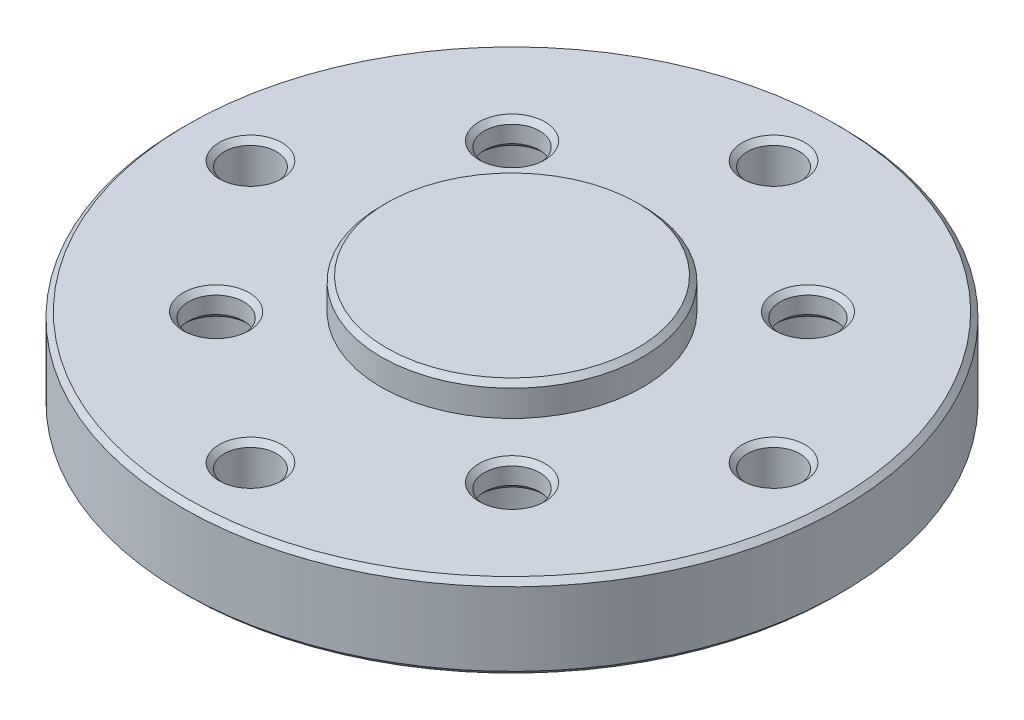
ISO-10303-21;
HEADER;
FILE_DESCRIPTION(('STEP AP214'),'2;1');
FILE_NAME('part.step','',(''),(''),'','','');
FILE_SCHEMA(('AUTOMOTIVE_DESIGN { 1 0 10303 214 1 1 1 1 }'));
ENDSEC;
DATA;
#1=APPLICATION_CONTEXT('core data for automotive mechanical design processes');
#2=APPLICATION_PROTOCOL_DEFINITION('international standard','automotive_design',2000,#1);
#3=PRODUCT_CONTEXT('',#1,'mechanical');
#4=PRODUCT('Part','Part','',(#3));
#5=PRODUCT_RELATED_PRODUCT_CATEGORY('part','',(#4));
#6=PRODUCT_DEFINITION_FORMATION('','',#4);
#7=PRODUCT_DEFINITION_CONTEXT('part definition',#1,'design');
#8=PRODUCT_DEFINITION('design','',#6,#7);
#9=PRODUCT_DEFINITION_SHAPE('','',#8);
#10=(LENGTH_UNIT() NAMED_UNIT(*) SI_UNIT(.MILLI.,.METRE.));
#11=(NAMED_UNIT(*) PLANE_ANGLE_UNIT() SI_UNIT($,.RADIAN.));
#12=(NAMED_UNIT(*) SI_UNIT($,.STERADIAN.) SOLID_ANGLE_UNIT());
#13=UNCERTAINTY_MEASURE_WITH_UNIT(LENGTH_MEASURE(1.E-05),#10,'distance_accuracy_value','');
#14=(GEOMETRIC_REPRESENTATION_CONTEXT(3) GLOBAL_UNCERTAINTY_ASSIGNED_CONTEXT((#13)) GLOBAL_UNIT_ASSIGNED_CONTEXT((#10,
#11,#12)) REPRESENTATION_CONTEXT('',''));
#15=CARTESIAN_POINT('',(0.,0.,0.));
#16=DIRECTION('',(0.,0.,1.));
#17=DIRECTION('',(1.,0.,0.));
#18=AXIS2_PLACEMENT_3D('',#15,#16,#17);
#19=CARTESIAN_POINT('',(0.,8.,0.));
#20=DIRECTION('',(0.,-1.,0.));
#21=DIRECTION('',(0.,0.,-1.));
#22=AXIS2_PLACEMENT_3D('',#19,#20,#21);
#23=CYLINDRICAL_SURFACE('',#22,31.5);
#24=CARTESIAN_POINT('',(0.,0.5,0.));
#25=DIRECTION('',(0.,1.,0.));
#26=DIRECTION('',(0.,0.,1.));
#27=AXIS2_PLACEMENT_3D('',#24,#25,#26);
#28=CIRCLE('',#27,31.5);
#29=CARTESIAN_POINT('',(0.,0.5,31.5));
#30=VERTEX_POINT('',#29);
#31=EDGE_CURVE('E43',#30,#30,#28,.T.);
#32=ORIENTED_EDGE('',*,*,#31,.T.);
#33=EDGE_LOOP('',(#32));
#34=FACE_BOUND('',#33,.T.);
#35=CARTESIAN_POINT('',(0.,7.50000000000003,0.));
#36=DIRECTION('',(0.,1.,0.));
#37=DIRECTION('',(0.,0.,1.));
#38=AXIS2_PLACEMENT_3D('',#35,#36,#37);
#39=CIRCLE('',#38,31.5);
#40=CARTESIAN_POINT('',(0.,7.50000000000003,31.5));
#41=VERTEX_POINT('',#40);
#42=EDGE_CURVE('E47',#41,#41,#39,.F.);
#43=ORIENTED_EDGE('',*,*,#42,.T.);
#44=EDGE_LOOP('',(#43));
#45=FACE_BOUND('',#44,.T.);
#46=ADVANCED_FACE('F32',(#34,#45),#23,.T.);
#47=CARTESIAN_POINT('',(0.,8.,0.));
#48=DIRECTION('',(0.,1.,0.));
#49=DIRECTION('',(0.,0.,1.));
#50=AXIS2_PLACEMENT_3D('',#47,#48,#49);
#51=PLANE('',#50);
#52=CARTESIAN_POINT('',(14.1421356237309,8.,14.142135623731));
#53=DIRECTION('',(0.,1.,0.));
#54=DIRECTION('',(0.,0.,1.));
#55=AXIS2_PLACEMENT_3D('',#52,#53,#54);
#56=CIRCLE('',#55,3.15000000000003);
#57=CARTESIAN_POINT('',(14.1421356237309,8.,17.292135623731));
#58=VERTEX_POINT('',#57);
#59=EDGE_CURVE('E145',#58,#58,#56,.F.);
#60=ORIENTED_EDGE('',*,*,#59,.T.);
#61=EDGE_LOOP('',(#60));
#62=FACE_BOUND('',#61,.T.);
#63=CARTESIAN_POINT('',(-14.1421356237309,8.,-14.1421356237309));
#64=DIRECTION('',(0.,1.,0.));
#65=DIRECTION('',(0.,0.,1.));
#66=AXIS2_PLACEMENT_3D('',#63,#64,#65);
#67=CIRCLE('',#66,3.15000000000003);
#68=CARTESIAN_POINT('',(-14.1421356237309,8.,-10.9921356237309));
#69=VERTEX_POINT('',#68);
#70=EDGE_CURVE('E148',#69,#69,#67,.F.);
#71=ORIENTED_EDGE('',*,*,#70,.T.);
#72=EDGE_LOOP('',(#71));
#73=FACE_BOUND('',#72,.T.);
#74=CARTESIAN_POINT('',(-14.1421356237309,8.,14.1421356237309));
#75=DIRECTION('',(0.,1.,0.));
#76=DIRECTION('',(0.,0.,1.));
#77=AXIS2_PLACEMENT_3D('',#74,#75,#76);
#78=CIRCLE('',#77,3.15000000000003);
#79=CARTESIAN_POINT('',(-14.1421356237309,8.,17.292135623731));
#80=VERTEX_POINT('',#79);
#81=EDGE_CURVE('E151',#80,#80,#78,.F.);
#82=ORIENTED_EDGE('',*,*,#81,.T.);
#83=EDGE_LOOP('',(#82));
#84=FACE_BOUND('',#83,.T.);
#85=CARTESIAN_POINT('',(14.1421356237309,8.,-14.1421356237309));
#86=DIRECTION('',(0.,1.,0.));
#87=DIRECTION('',(0.,0.,1.));
#88=AXIS2_PLACEMENT_3D('',#85,#86,#87);
#89=CIRCLE('',#88,3.15000000000003);
#90=CARTESIAN_POINT('',(14.1421356237309,8.,-10.9921356237309));
#91=VERTEX_POINT('',#90);
#92=EDGE_CURVE('E154',#91,#91,#89,.F.);
#93=ORIENTED_EDGE('',*,*,#92,.T.);
#94=EDGE_LOOP('',(#93));
#95=FACE_BOUND('',#94,.T.);
#96=CARTESIAN_POINT('',(0.,8.,25.));
#97=DIRECTION('',(0.,1.,0.));
#98=DIRECTION('',(0.,0.,1.));
#99=AXIS2_PLACEMENT_3D('',#96,#97,#98);
#100=CIRCLE('',#99,3.00000000000003);
#101=CARTESIAN_POINT('',(0.,8.,28.));
#102=VERTEX_POINT('',#101);
#103=EDGE_CURVE('E157',#102,#102,#100,.F.);
#104=ORIENTED_EDGE('',*,*,#103,.T.);
#105=EDGE_LOOP('',(#104));
#106=FACE_BOUND('',#105,.T.);
#107=CARTESIAN_POINT('',(25.,8.,0.));
#108=DIRECTION('',(0.,1.,0.));
#109=DIRECTION('',(0.,0.,1.));
#110=AXIS2_PLACEMENT_3D('',#107,#108,#109);
#111=CIRCLE('',#110,3.00000000000003);
#112=CARTESIAN_POINT('',(25.,8.,3.00000000000003));
#113=VERTEX_POINT('',#112);
#114=EDGE_CURVE('E160',#113,#113,#111,.F.);
#115=ORIENTED_EDGE('',*,*,#114,.T.);
#116=EDGE_LOOP('',(#115));
#117=FACE_BOUND('',#116,.T.);
#118=CARTESIAN_POINT('',(0.,8.,-25.));
#119=DIRECTION('',(0.,1.,0.));
#120=DIRECTION('',(0.,0.,1.));
#121=AXIS2_PLACEMENT_3D('',#118,#119,#120);
#122=CIRCLE('',#121,3.00000000000003);
#123=CARTESIAN_POINT('',(0.,8.,-22.));
#124=VERTEX_POINT('',#123);
#125=EDGE_CURVE('E163',#124,#124,#122,.F.);
#126=ORIENTED_EDGE('',*,*,#125,.T.);
#127=EDGE_LOOP('',(#126));
#128=FACE_BOUND('',#127,.T.);
#129=CARTESIAN_POINT('',(-25.,8.,0.));
#130=DIRECTION('',(0.,1.,0.));
#131=DIRECTION('',(0.,0.,1.));
#132=AXIS2_PLACEMENT_3D('',#129,#130,#131);
#133=CIRCLE('',#132,3.00000000000002);
#134=CARTESIAN_POINT('',(-25.,8.,3.00000000000002));
#135=VERTEX_POINT('',#134);
#136=EDGE_CURVE('E166',#135,#135,#133,.F.);
#137=ORIENTED_EDGE('',*,*,#136,.T.);
#138=EDGE_LOOP('',(#137));
#139=FACE_BOUND('',#138,.T.);
#140=CARTESIAN_POINT('',(0.,8.,0.));
#141=DIRECTION('',(0.,1.,0.));
#142=DIRECTION('',(0.,0.,1.));
#143=AXIS2_PLACEMENT_3D('',#140,#141,#142);
#144=CIRCLE('',#143,31.);
#145=CARTESIAN_POINT('',(0.,8.,31.));
#146=VERTEX_POINT('',#145);
#147=EDGE_CURVE('E169',#146,#146,#144,.T.);
#148=ORIENTED_EDGE('',*,*,#147,.T.);
#149=EDGE_LOOP('',(#148));
#150=FACE_BOUND('',#149,.T.);
#151=CARTESIAN_POINT('',(0.,8.,0.));
#152=DIRECTION('',(0.,1.,0.));
#153=DIRECTION('',(0.,0.,1.));
#154=AXIS2_PLACEMENT_3D('',#151,#152,#153);
#155=CIRCLE('',#154,12.5);
#156=CARTESIAN_POINT('',(0.,8.,12.5));
#157=VERTEX_POINT('',#156);
#158=EDGE_CURVE('E178',#157,#157,#155,.T.);
#159=ORIENTED_EDGE('',*,*,#158,.F.);
#160=EDGE_LOOP('',(#159));
#161=FACE_BOUND('',#160,.T.);
#162=ADVANCED_FACE('F212',(#62,#73,#84,#95,#106,#117,#128,#139,#150,#161),#51,.T.);
#163=CARTESIAN_POINT('',(0.,0.,0.));
#164=DIRECTION('',(0.,1.,0.));
#165=DIRECTION('',(0.,0.,1.));
#166=AXIS2_PLACEMENT_3D('',#163,#164,#165);
#167=PLANE('',#166);
#168=CARTESIAN_POINT('',(25.,0.,0.));
#169=DIRECTION('',(0.,1.,0.));
#170=DIRECTION('',(0.,0.,1.));
#171=AXIS2_PLACEMENT_3D('',#168,#169,#170);
#172=CIRCLE('',#171,3.);
#173=CARTESIAN_POINT('',(25.,0.,3.));
#174=VERTEX_POINT('',#173);
#175=EDGE_CURVE('E88',#174,#174,#172,.T.);
#176=ORIENTED_EDGE('',*,*,#175,.T.);
#177=EDGE_LOOP('',(#176));
#178=FACE_BOUND('',#177,.T.);
#179=CARTESIAN_POINT('',(0.,0.,25.));
#180=DIRECTION('',(0.,1.,0.));
#181=DIRECTION('',(0.,0.,1.));
#182=AXIS2_PLACEMENT_3D('',#179,#180,#181);
#183=CIRCLE('',#182,3.);
#184=CARTESIAN_POINT('',(0.,0.,28.));
#185=VERTEX_POINT('',#184);
#186=EDGE_CURVE('E91',#185,#185,#183,.T.);
#187=ORIENTED_EDGE('',*,*,#186,.T.);
#188=EDGE_LOOP('',(#187));
#189=FACE_BOUND('',#188,.T.);
#190=CARTESIAN_POINT('',(-25.,0.,0.));
#191=DIRECTION('',(0.,1.,0.));
#192=DIRECTION('',(0.,0.,1.));
#193=AXIS2_PLACEMENT_3D('',#190,#191,#192);
#194=CIRCLE('',#193,3.);
#195=CARTESIAN_POINT('',(-25.,0.,3.00000000000001));
#196=VERTEX_POINT('',#195);
#197=EDGE_CURVE('E94',#196,#196,#194,.T.);
#198=ORIENTED_EDGE('',*,*,#197,.T.);
#199=EDGE_LOOP('',(#198));
#200=FACE_BOUND('',#199,.T.);
#201=CARTESIAN_POINT('',(0.,0.,-25.));
#202=DIRECTION('',(0.,1.,0.));
#203=DIRECTION('',(0.,0.,1.));
#204=AXIS2_PLACEMENT_3D('',#201,#202,#203);
#205=CIRCLE('',#204,3.);
#206=CARTESIAN_POINT('',(0.,0.,-22.));
#207=VERTEX_POINT('',#206);
#208=EDGE_CURVE('E97',#207,#207,#205,.T.);
#209=ORIENTED_EDGE('',*,*,#208,.T.);
#210=EDGE_LOOP('',(#209));
#211=FACE_BOUND('',#210,.T.);
#212=CARTESIAN_POINT('',(-14.1421356237309,0.,-14.1421356237309));
#213=DIRECTION('',(0.,1.,0.));
#214=DIRECTION('',(0.,0.,1.));
#215=AXIS2_PLACEMENT_3D('',#212,#213,#214);
#216=CIRCLE('',#215,5.50000000000002);
#217=CARTESIAN_POINT('',(-14.1421356237309,0.,-8.64213562373093));
#218=VERTEX_POINT('',#217);
#219=EDGE_CURVE('E100',#218,#218,#216,.T.);
#220=ORIENTED_EDGE('',*,*,#219,.T.);
#221=EDGE_LOOP('',(#220));
#222=FACE_BOUND('',#221,.T.);
#223=CARTESIAN_POINT('',(14.1421356237309,0.,-14.1421356237309));
#224=DIRECTION('',(0.,1.,0.));
#225=DIRECTION('',(0.,0.,1.));
#226=AXIS2_PLACEMENT_3D('',#223,#224,#225);
#227=CIRCLE('',#226,5.50000000000002);
#228=CARTESIAN_POINT('',(14.1421356237309,0.,-8.64213562373093));
#229=VERTEX_POINT('',#228);
#230=EDGE_CURVE('E103',#229,#229,#227,.T.);
#231=ORIENTED_EDGE('',*,*,#230,.T.);
#232=EDGE_LOOP('',(#231));
#233=FACE_BOUND('',#232,.T.);
#234=CARTESIAN_POINT('',(14.1421356237309,0.,14.142135623731));
#235=DIRECTION('',(0.,1.,0.));
#236=DIRECTION('',(0.,0.,1.));
#237=AXIS2_PLACEMENT_3D('',#234,#235,#236);
#238=CIRCLE('',#237,5.49999999999998);
#239=CARTESIAN_POINT('',(14.1421356237309,0.,19.6421356237309));
#240=VERTEX_POINT('',#239);
#241=EDGE_CURVE('E106',#240,#240,#238,.T.);
#242=ORIENTED_EDGE('',*,*,#241,.T.);
#243=EDGE_LOOP('',(#242));
#244=FACE_BOUND('',#243,.T.);
#245=CARTESIAN_POINT('',(-14.1421356237309,0.,14.1421356237309));
#246=DIRECTION('',(0.,1.,0.));
#247=DIRECTION('',(0.,0.,1.));
#248=AXIS2_PLACEMENT_3D('',#245,#246,#247);
#249=CIRCLE('',#248,5.50000000000002);
#250=CARTESIAN_POINT('',(-14.1421356237309,0.,19.642135623731));
#251=VERTEX_POINT('',#250);
#252=EDGE_CURVE('E109',#251,#251,#249,.T.);
#253=ORIENTED_EDGE('',*,*,#252,.T.);
#254=EDGE_LOOP('',(#253));
#255=FACE_BOUND('',#254,.T.);
#256=CARTESIAN_POINT('',(0.,0.,0.));
#257=DIRECTION('',(0.,1.,0.));
#258=DIRECTION('',(0.,0.,1.));
#259=AXIS2_PLACEMENT_3D('',#256,#257,#258);
#260=CIRCLE('',#259,31.);
#261=CARTESIAN_POINT('',(0.,0.,31.));
#262=VERTEX_POINT('',#261);
#263=EDGE_CURVE('E112',#262,#262,#260,.F.);
#264=ORIENTED_EDGE('',*,*,#263,.T.);
#265=EDGE_LOOP('',(#264));
#266=FACE_BOUND('',#265,.T.);
#267=ADVANCED_FACE('F218',(#178,#189,#200,#211,#222,#233,#244,#255,#266),#167,.F.);
#268=CARTESIAN_POINT('',(0.,11.,0.));
#269=DIRECTION('',(0.,-1.,0.));
#270=DIRECTION('',(0.,0.,-1.));
#271=AXIS2_PLACEMENT_3D('',#268,#269,#270);
#272=CYLINDRICAL_SURFACE('',#271,12.5);
#273=CARTESIAN_POINT('',(0.,10.5,0.));
#274=DIRECTION('',(0.,1.,0.));
#275=DIRECTION('',(0.,0.,1.));
#276=AXIS2_PLACEMENT_3D('',#273,#274,#275);
#277=CIRCLE('',#276,12.5);
#278=CARTESIAN_POINT('',(0.,10.5,12.5));
#279=VERTEX_POINT('',#278);
#280=EDGE_CURVE('E10',#279,#279,#277,.F.);
#281=ORIENTED_EDGE('',*,*,#280,.T.);
#282=EDGE_LOOP('',(#281));
#283=FACE_BOUND('',#282,.T.);
#284=ORIENTED_EDGE('',*,*,#158,.T.);
#285=EDGE_LOOP('',(#284));
#286=FACE_BOUND('',#285,.T.);
#287=ADVANCED_FACE('F316',(#283,#286),#272,.T.);
#288=CARTESIAN_POINT('',(0.,11.,0.));
#289=DIRECTION('',(0.,1.,0.));
#290=DIRECTION('',(0.,0.,1.));
#291=AXIS2_PLACEMENT_3D('',#288,#289,#290);
#292=PLANE('',#291);
#293=CARTESIAN_POINT('',(0.,11.,0.));
#294=DIRECTION('',(0.,1.,0.));
#295=DIRECTION('',(0.,0.,1.));
#296=AXIS2_PLACEMENT_3D('',#293,#294,#295);
#297=CIRCLE('',#296,12.);
#298=CARTESIAN_POINT('',(0.,11.,12.));
#299=VERTEX_POINT('',#298);
#300=EDGE_CURVE('E39',#299,#299,#297,.T.);
#301=ORIENTED_EDGE('',*,*,#300,.T.);
#302=EDGE_LOOP('',(#301));
#303=FACE_BOUND('',#302,.T.);
#304=ADVANCED_FACE('F318',(#303),#292,.T.);
#305=CARTESIAN_POINT('',(0.,8.,25.));
#306=DIRECTION('',(0.,1.,0.));
#307=DIRECTION('',(0.,0.,1.));
#308=AXIS2_PLACEMENT_3D('',#305,#306,#307);
#309=CYLINDRICAL_SURFACE('',#308,2.5);
#310=CARTESIAN_POINT('',(0.,0.500000000000013,25.));
#311=DIRECTION('',(0.,1.,0.));
#312=DIRECTION('',(0.,0.,1.));
#313=AXIS2_PLACEMENT_3D('',#310,#311,#312);
#314=CIRCLE('',#313,2.5);
#315=CARTESIAN_POINT('',(0.,0.500000000000013,27.5));
#316=VERTEX_POINT('',#315);
#317=EDGE_CURVE('E76',#316,#316,#314,.F.);
#318=ORIENTED_EDGE('',*,*,#317,.T.);
#319=EDGE_LOOP('',(#318));
#320=FACE_BOUND('',#319,.T.);
#321=CARTESIAN_POINT('',(0.,7.49999999999997,25.));
#322=DIRECTION('',(0.,1.,0.));
#323=DIRECTION('',(0.,0.,1.));
#324=AXIS2_PLACEMENT_3D('',#321,#322,#323);
#325=CIRCLE('',#324,2.5);
#326=CARTESIAN_POINT('',(0.,7.49999999999997,27.5));
#327=VERTEX_POINT('',#326);
#328=EDGE_CURVE('E79',#327,#327,#325,.T.);
#329=ORIENTED_EDGE('',*,*,#328,.T.);
#330=EDGE_LOOP('',(#329));
#331=FACE_BOUND('',#330,.T.);
#332=ADVANCED_FACE('F324',(#320,#331),#309,.F.);
#333=CARTESIAN_POINT('',(25.,8.,0.));
#334=DIRECTION('',(0.,1.,0.));
#335=DIRECTION('',(0.,0.,1.));
#336=AXIS2_PLACEMENT_3D('',#333,#334,#335);
#337=CYLINDRICAL_SURFACE('',#336,2.5);
#338=CARTESIAN_POINT('',(25.,0.500000000000009,0.));
#339=DIRECTION('',(0.,1.,0.));
#340=DIRECTION('',(0.,0.,1.));
#341=AXIS2_PLACEMENT_3D('',#338,#339,#340);
#342=CIRCLE('',#341,2.5);
#343=CARTESIAN_POINT('',(25.,0.500000000000009,2.5));
#344=VERTEX_POINT('',#343);
#345=EDGE_CURVE('E82',#344,#344,#342,.F.);
#346=ORIENTED_EDGE('',*,*,#345,.T.);
#347=EDGE_LOOP('',(#346));
#348=FACE_BOUND('',#347,.T.);
#349=CARTESIAN_POINT('',(25.,7.49999999999997,0.));
#350=DIRECTION('',(0.,1.,0.));
#351=DIRECTION('',(0.,0.,1.));
#352=AXIS2_PLACEMENT_3D('',#349,#350,#351);
#353=CIRCLE('',#352,2.5);
#354=CARTESIAN_POINT('',(25.,7.49999999999997,2.5));
#355=VERTEX_POINT('',#354);
#356=EDGE_CURVE('E85',#355,#355,#353,.T.);
#357=ORIENTED_EDGE('',*,*,#356,.T.);
#358=EDGE_LOOP('',(#357));
#359=FACE_BOUND('',#358,.T.);
#360=ADVANCED_FACE('F330',(#348,#359),#337,.F.);
#361=CARTESIAN_POINT('',(0.,8.,-25.));
#362=DIRECTION('',(0.,1.,0.));
#363=DIRECTION('',(0.,0.,1.));
#364=AXIS2_PLACEMENT_3D('',#361,#362,#363);
#365=CYLINDRICAL_SURFACE('',#364,2.5);
#366=CARTESIAN_POINT('',(0.,0.500000000000013,-25.));
#367=DIRECTION('',(0.,1.,0.));
#368=DIRECTION('',(0.,0.,1.));
#369=AXIS2_PLACEMENT_3D('',#366,#367,#368);
#370=CIRCLE('',#369,2.5);
#371=CARTESIAN_POINT('',(0.,0.500000000000013,-22.5));
#372=VERTEX_POINT('',#371);
#373=EDGE_CURVE('E64',#372,#372,#370,.F.);
#374=ORIENTED_EDGE('',*,*,#373,.T.);
#375=EDGE_LOOP('',(#374));
#376=FACE_BOUND('',#375,.T.);
#377=CARTESIAN_POINT('',(0.,7.49999999999997,-25.));
#378=DIRECTION('',(0.,1.,0.));
#379=DIRECTION('',(0.,0.,1.));
#380=AXIS2_PLACEMENT_3D('',#377,#378,#379);
#381=CIRCLE('',#380,2.5);
#382=CARTESIAN_POINT('',(0.,7.49999999999997,-22.5));
#383=VERTEX_POINT('',#382);
#384=EDGE_CURVE('E67',#383,#383,#381,.T.);
#385=ORIENTED_EDGE('',*,*,#384,.T.);
#386=EDGE_LOOP('',(#385));
#387=FACE_BOUND('',#386,.T.);
#388=ADVANCED_FACE('F334',(#376,#387),#365,.F.);
#389=CARTESIAN_POINT('',(-25.,8.,0.));
#390=DIRECTION('',(0.,1.,0.));
#391=DIRECTION('',(0.,0.,1.));
#392=AXIS2_PLACEMENT_3D('',#389,#390,#391);
#393=CYLINDRICAL_SURFACE('',#392,2.5);
#394=CARTESIAN_POINT('',(-25.,0.500000000000009,0.));
#395=DIRECTION('',(0.,1.,0.));
#396=DIRECTION('',(0.,0.,1.));
#397=AXIS2_PLACEMENT_3D('',#394,#395,#396);
#398=CIRCLE('',#397,2.5);
#399=CARTESIAN_POINT('',(-25.,0.500000000000009,2.5));
#400=VERTEX_POINT('',#399);
#401=EDGE_CURVE('E70',#400,#400,#398,.F.);
#402=ORIENTED_EDGE('',*,*,#401,.T.);
#403=EDGE_LOOP('',(#402));
#404=FACE_BOUND('',#403,.T.);
#405=CARTESIAN_POINT('',(-25.,7.5,0.));
#406=DIRECTION('',(0.,1.,0.));
#407=DIRECTION('',(0.,0.,1.));
#408=AXIS2_PLACEMENT_3D('',#405,#406,#407);
#409=CIRCLE('',#408,2.5);
#410=CARTESIAN_POINT('',(-25.,7.5,2.5));
#411=VERTEX_POINT('',#410);
#412=EDGE_CURVE('E73',#411,#411,#409,.T.);
#413=ORIENTED_EDGE('',*,*,#412,.T.);
#414=EDGE_LOOP('',(#413));
#415=FACE_BOUND('',#414,.T.);
#416=ADVANCED_FACE('F338',(#404,#415),#393,.F.);
#417=CARTESIAN_POINT('',(14.1421356237309,0.,14.142135623731));
#418=DIRECTION('',(0.,-1.,0.));
#419=DIRECTION('',(0.,0.,-1.));
#420=AXIS2_PLACEMENT_3D('',#417,#418,#419);
#421=CYLINDRICAL_SURFACE('',#420,2.65);
#422=CARTESIAN_POINT('',(14.1421356237309,7.49999999999998,14.142135623731));
#423=DIRECTION('',(0.,1.,0.));
#424=DIRECTION('',(0.,0.,1.));
#425=AXIS2_PLACEMENT_3D('',#422,#423,#424);
#426=CIRCLE('',#425,2.65);
#427=CARTESIAN_POINT('',(14.1421356237309,7.49999999999998,16.7921356237309));
#428=VERTEX_POINT('',#427);
#429=EDGE_CURVE('E172',#428,#428,#426,.T.);
#430=ORIENTED_EDGE('',*,*,#429,.T.);
#431=EDGE_LOOP('',(#430));
#432=FACE_BOUND('',#431,.T.);
#433=CARTESIAN_POINT('',(14.1421356237309,5.90000000000001,14.142135623731));
#434=DIRECTION('',(0.,1.,0.));
#435=DIRECTION('',(0.,0.,1.));
#436=AXIS2_PLACEMENT_3D('',#433,#434,#435);
#437=CIRCLE('',#436,2.65);
#438=CARTESIAN_POINT('',(14.1421356237309,5.90000000000001,16.7921356237309));
#439=VERTEX_POINT('',#438);
#440=EDGE_CURVE('E175',#439,#439,#437,.F.);
#441=ORIENTED_EDGE('',*,*,#440,.T.);
#442=EDGE_LOOP('',(#441));
#443=FACE_BOUND('',#442,.T.);
#444=ADVANCED_FACE('F342',(#432,#443),#421,.F.);
#445=CARTESIAN_POINT('',(16.7921356237309,5.4,14.142135623731));
#446=DIRECTION('',(0.,1.,0.));
#447=DIRECTION('',(0.,0.,1.));
#448=AXIS2_PLACEMENT_3D('',#445,#446,#447);
#449=PLANE('',#448);
#450=CARTESIAN_POINT('',(14.1421356237309,5.4,14.142135623731));
#451=DIRECTION('',(0.,1.,0.));
#452=DIRECTION('',(0.,0.,1.));
#453=AXIS2_PLACEMENT_3D('',#450,#451,#452);
#454=CIRCLE('',#453,3.15000000000001);
#455=CARTESIAN_POINT('',(14.1421356237309,5.4,17.292135623731));
#456=VERTEX_POINT('',#455);
#457=EDGE_CURVE('E118',#456,#456,#454,.T.);
#458=ORIENTED_EDGE('',*,*,#457,.T.);
#459=EDGE_LOOP('',(#458));
#460=FACE_BOUND('',#459,.T.);
#461=CARTESIAN_POINT('',(14.1421356237309,5.4,14.142135623731));
#462=DIRECTION('',(0.,-1.,0.));
#463=DIRECTION('',(0.,0.,-1.));
#464=AXIS2_PLACEMENT_3D('',#461,#462,#463);
#465=CIRCLE('',#464,5.);
#466=CARTESIAN_POINT('',(14.1421356237309,5.4,9.14213562373095));
#467=VERTEX_POINT('',#466);
#468=EDGE_CURVE('E181',#467,#467,#465,.T.);
#469=ORIENTED_EDGE('',*,*,#468,.T.);
#470=EDGE_LOOP('',(#469));
#471=FACE_BOUND('',#470,.T.);
#472=ADVANCED_FACE('F346',(#460,#471),#449,.F.);
#473=CARTESIAN_POINT('',(14.1421356237309,0.,14.142135623731));
#474=DIRECTION('',(0.,-1.,0.));
#475=DIRECTION('',(0.,0.,-1.));
#476=AXIS2_PLACEMENT_3D('',#473,#474,#475);
#477=CYLINDRICAL_SURFACE('',#476,5.);
#478=CARTESIAN_POINT('',(14.1421356237309,0.499999999999985,14.142135623731));
#479=DIRECTION('',(0.,1.,0.));
#480=DIRECTION('',(0.,0.,1.));
#481=AXIS2_PLACEMENT_3D('',#478,#479,#480);
#482=CIRCLE('',#481,5.);
#483=CARTESIAN_POINT('',(14.1421356237309,0.499999999999985,19.1421356237309));
#484=VERTEX_POINT('',#483);
#485=EDGE_CURVE('E55',#484,#484,#482,.F.);
#486=ORIENTED_EDGE('',*,*,#485,.T.);
#487=EDGE_LOOP('',(#486));
#488=FACE_BOUND('',#487,.T.);
#489=ORIENTED_EDGE('',*,*,#468,.F.);
#490=EDGE_LOOP('',(#489));
#491=FACE_BOUND('',#490,.T.);
#492=ADVANCED_FACE('F350',(#488,#491),#477,.F.);
#493=CARTESIAN_POINT('',(-14.1421356237309,0.,14.1421356237309));
#494=DIRECTION('',(0.,-1.,0.));
#495=DIRECTION('',(0.,0.,-1.));
#496=AXIS2_PLACEMENT_3D('',#493,#494,#495);
#497=CYLINDRICAL_SURFACE('',#496,2.65);
#498=CARTESIAN_POINT('',(-14.1421356237309,5.90000000000001,14.1421356237309));
#499=DIRECTION('',(0.,1.,0.));
#500=DIRECTION('',(0.,0.,1.));
#501=AXIS2_PLACEMENT_3D('',#498,#499,#500);
#502=CIRCLE('',#501,2.65);
#503=CARTESIAN_POINT('',(-14.1421356237309,5.90000000000001,16.7921356237309));
#504=VERTEX_POINT('',#503);
#505=EDGE_CURVE('E139',#504,#504,#502,.F.);
#506=ORIENTED_EDGE('',*,*,#505,.T.);
#507=EDGE_LOOP('',(#506));
#508=FACE_BOUND('',#507,.T.);
#509=CARTESIAN_POINT('',(-14.1421356237309,7.49999999999998,14.1421356237309));
#510=DIRECTION('',(0.,1.,0.));
#511=DIRECTION('',(0.,0.,1.));
#512=AXIS2_PLACEMENT_3D('',#509,#510,#511);
#513=CIRCLE('',#512,2.65);
#514=CARTESIAN_POINT('',(-14.1421356237309,7.49999999999998,16.7921356237309));
#515=VERTEX_POINT('',#514);
#516=EDGE_CURVE('E142',#515,#515,#513,.T.);
#517=ORIENTED_EDGE('',*,*,#516,.T.);
#518=EDGE_LOOP('',(#517));
#519=FACE_BOUND('',#518,.T.);
#520=ADVANCED_FACE('F354',(#508,#519),#497,.F.);
#521=CARTESIAN_POINT('',(-11.4921356237309,5.4,14.1421356237309));
#522=DIRECTION('',(0.,1.,0.));
#523=DIRECTION('',(0.,0.,1.));
#524=AXIS2_PLACEMENT_3D('',#521,#522,#523);
#525=PLANE('',#524);
#526=CARTESIAN_POINT('',(-14.1421356237309,5.4,14.1421356237309));
#527=DIRECTION('',(0.,1.,0.));
#528=DIRECTION('',(0.,0.,1.));
#529=AXIS2_PLACEMENT_3D('',#526,#527,#528);
#530=CIRCLE('',#529,3.15000000000001);
#531=CARTESIAN_POINT('',(-14.1421356237309,5.4,17.292135623731));
#532=VERTEX_POINT('',#531);
#533=EDGE_CURVE('E136',#532,#532,#530,.T.);
#534=ORIENTED_EDGE('',*,*,#533,.T.);
#535=EDGE_LOOP('',(#534));
#536=FACE_BOUND('',#535,.T.);
#537=CARTESIAN_POINT('',(-14.1421356237309,5.4,14.1421356237309));
#538=DIRECTION('',(0.,-1.,0.));
#539=DIRECTION('',(0.,0.,-1.));
#540=AXIS2_PLACEMENT_3D('',#537,#538,#539);
#541=CIRCLE('',#540,5.);
#542=CARTESIAN_POINT('',(-14.1421356237309,5.4,9.14213562373095));
#543=VERTEX_POINT('',#542);
#544=EDGE_CURVE('E184',#543,#543,#541,.T.);
#545=ORIENTED_EDGE('',*,*,#544,.T.);
#546=EDGE_LOOP('',(#545));
#547=FACE_BOUND('',#546,.T.);
#548=ADVANCED_FACE('F358',(#536,#547),#525,.F.);
#549=CARTESIAN_POINT('',(-14.1421356237309,0.,14.1421356237309));
#550=DIRECTION('',(0.,-1.,0.));
#551=DIRECTION('',(0.,0.,-1.));
#552=AXIS2_PLACEMENT_3D('',#549,#550,#551);
#553=CYLINDRICAL_SURFACE('',#552,5.);
#554=CARTESIAN_POINT('',(-14.1421356237309,0.500000000000012,14.1421356237309));
#555=DIRECTION('',(0.,1.,0.));
#556=DIRECTION('',(0.,0.,1.));
#557=AXIS2_PLACEMENT_3D('',#554,#555,#556);
#558=CIRCLE('',#557,5.);
#559=CARTESIAN_POINT('',(-14.1421356237309,0.500000000000012,19.1421356237309));
#560=VERTEX_POINT('',#559);
#561=EDGE_CURVE('E52',#560,#560,#558,.F.);
#562=ORIENTED_EDGE('',*,*,#561,.T.);
#563=EDGE_LOOP('',(#562));
#564=FACE_BOUND('',#563,.T.);
#565=ORIENTED_EDGE('',*,*,#544,.F.);
#566=EDGE_LOOP('',(#565));
#567=FACE_BOUND('',#566,.T.);
#568=ADVANCED_FACE('F362',(#564,#567),#553,.F.);
#569=CARTESIAN_POINT('',(-14.1421356237309,0.,-14.1421356237309));
#570=DIRECTION('',(0.,-1.,0.));
#571=DIRECTION('',(0.,0.,-1.));
#572=AXIS2_PLACEMENT_3D('',#569,#570,#571);
#573=CYLINDRICAL_SURFACE('',#572,2.65);
#574=CARTESIAN_POINT('',(-14.1421356237309,7.49999999999998,-14.1421356237309));
#575=DIRECTION('',(0.,1.,0.));
#576=DIRECTION('',(0.,0.,1.));
#577=AXIS2_PLACEMENT_3D('',#574,#575,#576);
#578=CIRCLE('',#577,2.65);
#579=CARTESIAN_POINT('',(-14.1421356237309,7.49999999999998,-11.4921356237309));
#580=VERTEX_POINT('',#579);
#581=EDGE_CURVE('E130',#580,#580,#578,.T.);
#582=ORIENTED_EDGE('',*,*,#581,.T.);
#583=EDGE_LOOP('',(#582));
#584=FACE_BOUND('',#583,.T.);
#585=CARTESIAN_POINT('',(-14.1421356237309,5.90000000000001,-14.1421356237309));
#586=DIRECTION('',(0.,1.,0.));
#587=DIRECTION('',(0.,0.,1.));
#588=AXIS2_PLACEMENT_3D('',#585,#586,#587);
#589=CIRCLE('',#588,2.65);
#590=CARTESIAN_POINT('',(-14.1421356237309,5.90000000000001,-11.4921356237309));
#591=VERTEX_POINT('',#590);
#592=EDGE_CURVE('E133',#591,#591,#589,.F.);
#593=ORIENTED_EDGE('',*,*,#592,.T.);
#594=EDGE_LOOP('',(#593));
#595=FACE_BOUND('',#594,.T.);
#596=ADVANCED_FACE('F366',(#584,#595),#573,.F.);
#597=CARTESIAN_POINT('',(-11.4921356237309,5.4,-14.1421356237309));
#598=DIRECTION('',(0.,1.,0.));
#599=DIRECTION('',(0.,0.,1.));
#600=AXIS2_PLACEMENT_3D('',#597,#598,#599);
#601=PLANE('',#600);
#602=CARTESIAN_POINT('',(-14.1421356237309,5.4,-14.1421356237309));
#603=DIRECTION('',(0.,1.,0.));
#604=DIRECTION('',(0.,0.,1.));
#605=AXIS2_PLACEMENT_3D('',#602,#603,#604);
#606=CIRCLE('',#605,3.15000000000001);
#607=CARTESIAN_POINT('',(-14.1421356237309,5.4,-10.9921356237309));
#608=VERTEX_POINT('',#607);
#609=EDGE_CURVE('E115',#608,#608,#606,.T.);
#610=ORIENTED_EDGE('',*,*,#609,.T.);
#611=EDGE_LOOP('',(#610));
#612=FACE_BOUND('',#611,.T.);
#613=CARTESIAN_POINT('',(-14.1421356237309,5.4,-14.1421356237309));
#614=DIRECTION('',(0.,-1.,0.));
#615=DIRECTION('',(0.,0.,-1.));
#616=AXIS2_PLACEMENT_3D('',#613,#614,#615);
#617=CIRCLE('',#616,5.);
#618=CARTESIAN_POINT('',(-14.1421356237309,5.4,-19.1421356237309));
#619=VERTEX_POINT('',#618);
#620=EDGE_CURVE('E187',#619,#619,#617,.T.);
#621=ORIENTED_EDGE('',*,*,#620,.T.);
#622=EDGE_LOOP('',(#621));
#623=FACE_BOUND('',#622,.T.);
#624=ADVANCED_FACE('F370',(#612,#623),#601,.F.);
#625=CARTESIAN_POINT('',(-14.1421356237309,0.,-14.1421356237309));
#626=DIRECTION('',(0.,-1.,0.));
#627=DIRECTION('',(0.,0.,-1.));
#628=AXIS2_PLACEMENT_3D('',#625,#626,#627);
#629=CYLINDRICAL_SURFACE('',#628,5.);
#630=CARTESIAN_POINT('',(-14.1421356237309,0.500000000000012,-14.1421356237309));
#631=DIRECTION('',(0.,1.,0.));
#632=DIRECTION('',(0.,0.,1.));
#633=AXIS2_PLACEMENT_3D('',#630,#631,#632);
#634=CIRCLE('',#633,5.);
#635=CARTESIAN_POINT('',(-14.1421356237309,0.500000000000012,-9.14213562373095));
#636=VERTEX_POINT('',#635);
#637=EDGE_CURVE('E61',#636,#636,#634,.F.);
#638=ORIENTED_EDGE('',*,*,#637,.T.);
#639=EDGE_LOOP('',(#638));
#640=FACE_BOUND('',#639,.T.);
#641=ORIENTED_EDGE('',*,*,#620,.F.);
#642=EDGE_LOOP('',(#641));
#643=FACE_BOUND('',#642,.T.);
#644=ADVANCED_FACE('F374',(#640,#643),#629,.F.);
#645=CARTESIAN_POINT('',(14.1421356237309,0.,-14.1421356237309));
#646=DIRECTION('',(0.,-1.,0.));
#647=DIRECTION('',(0.,0.,-1.));
#648=AXIS2_PLACEMENT_3D('',#645,#646,#647);
#649=CYLINDRICAL_SURFACE('',#648,2.65);
#650=CARTESIAN_POINT('',(14.1421356237309,5.90000000000001,-14.1421356237309));
#651=DIRECTION('',(0.,1.,0.));
#652=DIRECTION('',(0.,0.,1.));
#653=AXIS2_PLACEMENT_3D('',#650,#651,#652);
#654=CIRCLE('',#653,2.65);
#655=CARTESIAN_POINT('',(14.1421356237309,5.90000000000001,-11.4921356237309));
#656=VERTEX_POINT('',#655);
#657=EDGE_CURVE('E124',#656,#656,#654,.F.);
#658=ORIENTED_EDGE('',*,*,#657,.T.);
#659=EDGE_LOOP('',(#658));
#660=FACE_BOUND('',#659,.T.);
#661=CARTESIAN_POINT('',(14.1421356237309,7.49999999999998,-14.1421356237309));
#662=DIRECTION('',(0.,1.,0.));
#663=DIRECTION('',(0.,0.,1.));
#664=AXIS2_PLACEMENT_3D('',#661,#662,#663);
#665=CIRCLE('',#664,2.65);
#666=CARTESIAN_POINT('',(14.1421356237309,7.49999999999998,-11.4921356237309));
#667=VERTEX_POINT('',#666);
#668=EDGE_CURVE('E127',#667,#667,#665,.T.);
#669=ORIENTED_EDGE('',*,*,#668,.T.);
#670=EDGE_LOOP('',(#669));
#671=FACE_BOUND('',#670,.T.);
#672=ADVANCED_FACE('F208',(#660,#671),#649,.F.);
#673=CARTESIAN_POINT('',(16.7921356237309,5.4,-14.1421356237309));
#674=DIRECTION('',(0.,1.,0.));
#675=DIRECTION('',(0.,0.,1.));
#676=AXIS2_PLACEMENT_3D('',#673,#674,#675);
#677=PLANE('',#676);
#678=CARTESIAN_POINT('',(14.1421356237309,5.4,-14.1421356237309));
#679=DIRECTION('',(0.,1.,0.));
#680=DIRECTION('',(0.,0.,1.));
#681=AXIS2_PLACEMENT_3D('',#678,#679,#680);
#682=CIRCLE('',#681,3.15000000000001);
#683=CARTESIAN_POINT('',(14.1421356237309,5.4,-10.9921356237309));
#684=VERTEX_POINT('',#683);
#685=EDGE_CURVE('E121',#684,#684,#682,.T.);
#686=ORIENTED_EDGE('',*,*,#685,.T.);
#687=EDGE_LOOP('',(#686));
#688=FACE_BOUND('',#687,.T.);
#689=CARTESIAN_POINT('',(14.1421356237309,5.4,-14.1421356237309));
#690=DIRECTION('',(0.,-1.,0.));
#691=DIRECTION('',(0.,0.,-1.));
#692=AXIS2_PLACEMENT_3D('',#689,#690,#691);
#693=CIRCLE('',#692,5.);
#694=CARTESIAN_POINT('',(14.1421356237309,5.4,-19.1421356237309));
#695=VERTEX_POINT('',#694);
#696=EDGE_CURVE('E190',#695,#695,#693,.T.);
#697=ORIENTED_EDGE('',*,*,#696,.T.);
#698=EDGE_LOOP('',(#697));
#699=FACE_BOUND('',#698,.T.);
#700=ADVANCED_FACE('F194',(#688,#699),#677,.F.);
#701=CARTESIAN_POINT('',(14.1421356237309,0.,-14.1421356237309));
#702=DIRECTION('',(0.,-1.,0.));
#703=DIRECTION('',(0.,0.,-1.));
#704=AXIS2_PLACEMENT_3D('',#701,#702,#703);
#705=CYLINDRICAL_SURFACE('',#704,5.);
#706=CARTESIAN_POINT('',(14.1421356237309,0.500000000000013,-14.1421356237309));
#707=DIRECTION('',(0.,1.,0.));
#708=DIRECTION('',(0.,0.,1.));
#709=AXIS2_PLACEMENT_3D('',#706,#707,#708);
#710=CIRCLE('',#709,5.);
#711=CARTESIAN_POINT('',(14.1421356237309,0.500000000000013,-9.14213562373095));
#712=VERTEX_POINT('',#711);
#713=EDGE_CURVE('E58',#712,#712,#710,.F.);
#714=ORIENTED_EDGE('',*,*,#713,.T.);
#715=EDGE_LOOP('',(#714));
#716=FACE_BOUND('',#715,.T.);
#717=ORIENTED_EDGE('',*,*,#696,.F.);
#718=EDGE_LOOP('',(#717));
#719=FACE_BOUND('',#718,.T.);
#720=ADVANCED_FACE('F196',(#716,#719),#705,.F.);
#721=CARTESIAN_POINT('',(14.1421356237309,7.49999999999998,14.142135623731));
#722=DIRECTION('',(0.,1.,0.));
#723=DIRECTION('',(0.,0.,1.));
#724=AXIS2_PLACEMENT_3D('',#721,#722,#723);
#725=CONICAL_SURFACE('',#724,2.65,0.785398163397453);
#726=ORIENTED_EDGE('',*,*,#59,.F.);
#727=EDGE_LOOP('',(#726));
#728=FACE_BOUND('',#727,.T.);
#729=ORIENTED_EDGE('',*,*,#429,.F.);
#730=EDGE_LOOP('',(#729));
#731=FACE_BOUND('',#730,.T.);
#732=ADVANCED_FACE('F198',(#728,#731),#725,.F.);
#733=CARTESIAN_POINT('',(-14.1421356237309,5.90000000000001,14.1421356237309));
#734=DIRECTION('',(0.,-1.,0.));
#735=DIRECTION('',(0.,0.,-1.));
#736=AXIS2_PLACEMENT_3D('',#733,#734,#735);
#737=CONICAL_SURFACE('',#736,2.65,0.785398163397453);
#738=ORIENTED_EDGE('',*,*,#533,.F.);
#739=EDGE_LOOP('',(#738));
#740=FACE_BOUND('',#739,.T.);
#741=ORIENTED_EDGE('',*,*,#505,.F.);
#742=EDGE_LOOP('',(#741));
#743=FACE_BOUND('',#742,.T.);
#744=ADVANCED_FACE('F205',(#740,#743),#737,.F.);
#745=CARTESIAN_POINT('',(-14.1421356237309,7.49999999999998,-14.1421356237309));
#746=DIRECTION('',(0.,1.,0.));
#747=DIRECTION('',(0.,0.,1.));
#748=AXIS2_PLACEMENT_3D('',#745,#746,#747);
#749=CONICAL_SURFACE('',#748,2.65,0.785398163397453);
#750=ORIENTED_EDGE('',*,*,#70,.F.);
#751=EDGE_LOOP('',(#750));
#752=FACE_BOUND('',#751,.T.);
#753=ORIENTED_EDGE('',*,*,#581,.F.);
#754=EDGE_LOOP('',(#753));
#755=FACE_BOUND('',#754,.T.);
#756=ADVANCED_FACE('F226',(#752,#755),#749,.F.);
#757=CARTESIAN_POINT('',(14.1421356237309,5.90000000000001,-14.1421356237309));
#758=DIRECTION('',(0.,-1.,0.));
#759=DIRECTION('',(0.,0.,-1.));
#760=AXIS2_PLACEMENT_3D('',#757,#758,#759);
#761=CONICAL_SURFACE('',#760,2.65,0.785398163397454);
#762=ORIENTED_EDGE('',*,*,#685,.F.);
#763=EDGE_LOOP('',(#762));
#764=FACE_BOUND('',#763,.T.);
#765=ORIENTED_EDGE('',*,*,#657,.F.);
#766=EDGE_LOOP('',(#765));
#767=FACE_BOUND('',#766,.T.);
#768=ADVANCED_FACE('F230',(#764,#767),#761,.F.);
#769=CARTESIAN_POINT('',(-14.1421356237309,7.49999999999998,14.1421356237309));
#770=DIRECTION('',(0.,1.,0.));
#771=DIRECTION('',(0.,0.,1.));
#772=AXIS2_PLACEMENT_3D('',#769,#770,#771);
#773=CONICAL_SURFACE('',#772,2.65,0.785398163397453);
#774=ORIENTED_EDGE('',*,*,#81,.F.);
#775=EDGE_LOOP('',(#774));
#776=FACE_BOUND('',#775,.T.);
#777=ORIENTED_EDGE('',*,*,#516,.F.);
#778=EDGE_LOOP('',(#777));
#779=FACE_BOUND('',#778,.T.);
#780=ADVANCED_FACE('F234',(#776,#779),#773,.F.);
#781=CARTESIAN_POINT('',(14.1421356237309,5.90000000000001,14.142135623731));
#782=DIRECTION('',(0.,-1.,0.));
#783=DIRECTION('',(0.,0.,-1.));
#784=AXIS2_PLACEMENT_3D('',#781,#782,#783);
#785=CONICAL_SURFACE('',#784,2.65,0.785398163397452);
#786=ORIENTED_EDGE('',*,*,#457,.F.);
#787=EDGE_LOOP('',(#786));
#788=FACE_BOUND('',#787,.T.);
#789=ORIENTED_EDGE('',*,*,#440,.F.);
#790=EDGE_LOOP('',(#789));
#791=FACE_BOUND('',#790,.T.);
#792=ADVANCED_FACE('F238',(#788,#791),#785,.F.);
#793=CARTESIAN_POINT('',(14.1421356237309,7.49999999999998,-14.1421356237309));
#794=DIRECTION('',(0.,1.,0.));
#795=DIRECTION('',(0.,0.,1.));
#796=AXIS2_PLACEMENT_3D('',#793,#794,#795);
#797=CONICAL_SURFACE('',#796,2.65,0.785398163397454);
#798=ORIENTED_EDGE('',*,*,#92,.F.);
#799=EDGE_LOOP('',(#798));
#800=FACE_BOUND('',#799,.T.);
#801=ORIENTED_EDGE('',*,*,#668,.F.);
#802=EDGE_LOOP('',(#801));
#803=FACE_BOUND('',#802,.T.);
#804=ADVANCED_FACE('F242',(#800,#803),#797,.F.);
#805=CARTESIAN_POINT('',(-14.1421356237309,5.90000000000001,-14.1421356237309));
#806=DIRECTION('',(0.,-1.,0.));
#807=DIRECTION('',(0.,0.,-1.));
#808=AXIS2_PLACEMENT_3D('',#805,#806,#807);
#809=CONICAL_SURFACE('',#808,2.65,0.785398163397453);
#810=ORIENTED_EDGE('',*,*,#609,.F.);
#811=EDGE_LOOP('',(#810));
#812=FACE_BOUND('',#811,.T.);
#813=ORIENTED_EDGE('',*,*,#592,.F.);
#814=EDGE_LOOP('',(#813));
#815=FACE_BOUND('',#814,.T.);
#816=ADVANCED_FACE('F246',(#812,#815),#809,.F.);
#817=CARTESIAN_POINT('',(25.,0.,0.));
#818=DIRECTION('',(0.,-1.,0.));
#819=DIRECTION('',(0.,0.,-1.));
#820=AXIS2_PLACEMENT_3D('',#817,#818,#819);
#821=CONICAL_SURFACE('',#820,3.,0.785398163397443);
#822=ORIENTED_EDGE('',*,*,#345,.F.);
#823=EDGE_LOOP('',(#822));
#824=FACE_BOUND('',#823,.T.);
#825=ORIENTED_EDGE('',*,*,#175,.F.);
#826=EDGE_LOOP('',(#825));
#827=FACE_BOUND('',#826,.T.);
#828=ADVANCED_FACE('F250',(#824,#827),#821,.F.);
#829=CARTESIAN_POINT('',(0.,0.,25.));
#830=DIRECTION('',(0.,-1.,0.));
#831=DIRECTION('',(0.,0.,-1.));
#832=AXIS2_PLACEMENT_3D('',#829,#830,#831);
#833=CONICAL_SURFACE('',#832,3.,0.78539816339744);
#834=ORIENTED_EDGE('',*,*,#317,.F.);
#835=EDGE_LOOP('',(#834));
#836=FACE_BOUND('',#835,.T.);
#837=ORIENTED_EDGE('',*,*,#186,.F.);
#838=EDGE_LOOP('',(#837));
#839=FACE_BOUND('',#838,.T.);
#840=ADVANCED_FACE('F254',(#836,#839),#833,.F.);
#841=CARTESIAN_POINT('',(-25.,0.,0.));
#842=DIRECTION('',(0.,-1.,0.));
#843=DIRECTION('',(0.,0.,-1.));
#844=AXIS2_PLACEMENT_3D('',#841,#842,#843);
#845=CONICAL_SURFACE('',#844,3.,0.785398163397443);
#846=ORIENTED_EDGE('',*,*,#401,.F.);
#847=EDGE_LOOP('',(#846));
#848=FACE_BOUND('',#847,.T.);
#849=ORIENTED_EDGE('',*,*,#197,.F.);
#850=EDGE_LOOP('',(#849));
#851=FACE_BOUND('',#850,.T.);
#852=ADVANCED_FACE('F258',(#848,#851),#845,.F.);
#853=CARTESIAN_POINT('',(0.,0.,-25.));
#854=DIRECTION('',(0.,-1.,0.));
#855=DIRECTION('',(0.,0.,-1.));
#856=AXIS2_PLACEMENT_3D('',#853,#854,#855);
#857=CONICAL_SURFACE('',#856,3.,0.78539816339744);
#858=ORIENTED_EDGE('',*,*,#373,.F.);
#859=EDGE_LOOP('',(#858));
#860=FACE_BOUND('',#859,.T.);
#861=ORIENTED_EDGE('',*,*,#208,.F.);
#862=EDGE_LOOP('',(#861));
#863=FACE_BOUND('',#862,.T.);
#864=ADVANCED_FACE('F262',(#860,#863),#857,.F.);
#865=CARTESIAN_POINT('',(0.,7.49999999999997,25.));
#866=DIRECTION('',(0.,1.,0.));
#867=DIRECTION('',(0.,0.,1.));
#868=AXIS2_PLACEMENT_3D('',#865,#866,#867);
#869=CONICAL_SURFACE('',#868,2.5,0.785398163397453);
#870=ORIENTED_EDGE('',*,*,#103,.F.);
#871=EDGE_LOOP('',(#870));
#872=FACE_BOUND('',#871,.T.);
#873=ORIENTED_EDGE('',*,*,#328,.F.);
#874=EDGE_LOOP('',(#873));
#875=FACE_BOUND('',#874,.T.);
#876=ADVANCED_FACE('F266',(#872,#875),#869,.F.);
#877=CARTESIAN_POINT('',(25.,7.49999999999997,0.));
#878=DIRECTION('',(0.,1.,0.));
#879=DIRECTION('',(0.,0.,1.));
#880=AXIS2_PLACEMENT_3D('',#877,#878,#879);
#881=CONICAL_SURFACE('',#880,2.5,0.785398163397453);
#882=ORIENTED_EDGE('',*,*,#114,.F.);
#883=EDGE_LOOP('',(#882));
#884=FACE_BOUND('',#883,.T.);
#885=ORIENTED_EDGE('',*,*,#356,.F.);
#886=EDGE_LOOP('',(#885));
#887=FACE_BOUND('',#886,.T.);
#888=ADVANCED_FACE('F270',(#884,#887),#881,.F.);
#889=CARTESIAN_POINT('',(0.,7.49999999999997,-25.));
#890=DIRECTION('',(0.,1.,0.));
#891=DIRECTION('',(0.,0.,1.));
#892=AXIS2_PLACEMENT_3D('',#889,#890,#891);
#893=CONICAL_SURFACE('',#892,2.5,0.785398163397453);
#894=ORIENTED_EDGE('',*,*,#125,.F.);
#895=EDGE_LOOP('',(#894));
#896=FACE_BOUND('',#895,.T.);
#897=ORIENTED_EDGE('',*,*,#384,.F.);
#898=EDGE_LOOP('',(#897));
#899=FACE_BOUND('',#898,.T.);
#900=ADVANCED_FACE('F274',(#896,#899),#893,.F.);
#901=CARTESIAN_POINT('',(-25.,7.5,0.));
#902=DIRECTION('',(0.,1.,0.));
#903=DIRECTION('',(0.,0.,1.));
#904=AXIS2_PLACEMENT_3D('',#901,#902,#903);
#905=CONICAL_SURFACE('',#904,2.5,0.785398163397467);
#906=ORIENTED_EDGE('',*,*,#136,.F.);
#907=EDGE_LOOP('',(#906));
#908=FACE_BOUND('',#907,.T.);
#909=ORIENTED_EDGE('',*,*,#412,.F.);
#910=EDGE_LOOP('',(#909));
#911=FACE_BOUND('',#910,.T.);
#912=ADVANCED_FACE('F278',(#908,#911),#905,.F.);
#913=CARTESIAN_POINT('',(-14.1421356237309,0.500000000000013,-14.1421356237309));
#914=DIRECTION('',(0.,-1.,0.));
#915=DIRECTION('',(0.,0.,-1.));
#916=AXIS2_PLACEMENT_3D('',#913,#914,#915);
#917=CONICAL_SURFACE('',#916,5.,0.785398163397458);
#918=ORIENTED_EDGE('',*,*,#219,.F.);
#919=EDGE_LOOP('',(#918));
#920=FACE_BOUND('',#919,.T.);
#921=ORIENTED_EDGE('',*,*,#637,.F.);
#922=EDGE_LOOP('',(#921));
#923=FACE_BOUND('',#922,.T.);
#924=ADVANCED_FACE('F282',(#920,#923),#917,.F.);
#925=CARTESIAN_POINT('',(14.1421356237309,0.500000000000013,-14.1421356237309));
#926=DIRECTION('',(0.,-1.,0.));
#927=DIRECTION('',(0.,0.,-1.));
#928=AXIS2_PLACEMENT_3D('',#925,#926,#927);
#929=CONICAL_SURFACE('',#928,5.,0.785398163397458);
#930=ORIENTED_EDGE('',*,*,#230,.F.);
#931=EDGE_LOOP('',(#930));
#932=FACE_BOUND('',#931,.T.);
#933=ORIENTED_EDGE('',*,*,#713,.F.);
#934=EDGE_LOOP('',(#933));
#935=FACE_BOUND('',#934,.T.);
#936=ADVANCED_FACE('F286',(#932,#935),#929,.F.);
#937=CARTESIAN_POINT('',(14.1421356237309,0.499999999999985,14.142135623731));
#938=DIRECTION('',(0.,-1.,0.));
#939=DIRECTION('',(0.,0.,-1.));
#940=AXIS2_PLACEMENT_3D('',#937,#938,#939);
#941=CONICAL_SURFACE('',#940,5.,0.785398163397443);
#942=ORIENTED_EDGE('',*,*,#241,.F.);
#943=EDGE_LOOP('',(#942));
#944=FACE_BOUND('',#943,.T.);
#945=ORIENTED_EDGE('',*,*,#485,.F.);
#946=EDGE_LOOP('',(#945));
#947=FACE_BOUND('',#946,.T.);
#948=ADVANCED_FACE('F290',(#944,#947),#941,.F.);
#949=CARTESIAN_POINT('',(-14.1421356237309,0.500000000000013,14.1421356237309));
#950=DIRECTION('',(0.,-1.,0.));
#951=DIRECTION('',(0.,0.,-1.));
#952=AXIS2_PLACEMENT_3D('',#949,#950,#951);
#953=CONICAL_SURFACE('',#952,5.,0.785398163397458);
#954=ORIENTED_EDGE('',*,*,#252,.F.);
#955=EDGE_LOOP('',(#954));
#956=FACE_BOUND('',#955,.T.);
#957=ORIENTED_EDGE('',*,*,#561,.F.);
#958=EDGE_LOOP('',(#957));
#959=FACE_BOUND('',#958,.T.);
#960=ADVANCED_FACE('F294',(#956,#959),#953,.F.);
#961=CARTESIAN_POINT('',(0.,0.5,0.));
#962=DIRECTION('',(0.,1.,0.));
#963=DIRECTION('',(0.,0.,1.));
#964=AXIS2_PLACEMENT_3D('',#961,#962,#963);
#965=CONICAL_SURFACE('',#964,31.5,0.785398163397455);
#966=ORIENTED_EDGE('',*,*,#263,.F.);
#967=EDGE_LOOP('',(#966));
#968=FACE_BOUND('',#967,.T.);
#969=ORIENTED_EDGE('',*,*,#31,.F.);
#970=EDGE_LOOP('',(#969));
#971=FACE_BOUND('',#970,.T.);
#972=ADVANCED_FACE('F298',(#968,#971),#965,.T.);
#973=CARTESIAN_POINT('',(0.,8.,0.));
#974=DIRECTION('',(0.,-1.,0.));
#975=DIRECTION('',(0.,0.,-1.));
#976=AXIS2_PLACEMENT_3D('',#973,#974,#975);
#977=CONICAL_SURFACE('',#976,31.,0.785398163397448);
#978=ORIENTED_EDGE('',*,*,#42,.F.);
#979=EDGE_LOOP('',(#978));
#980=FACE_BOUND('',#979,.T.);
#981=ORIENTED_EDGE('',*,*,#147,.F.);
#982=EDGE_LOOP('',(#981));
#983=FACE_BOUND('',#982,.T.);
#984=ADVANCED_FACE('F301',(#980,#983),#977,.T.);
#985=CARTESIAN_POINT('',(0.,11.,0.));
#986=DIRECTION('',(0.,-1.,0.));
#987=DIRECTION('',(0.,0.,-1.));
#988=AXIS2_PLACEMENT_3D('',#985,#986,#987);
#989=CONICAL_SURFACE('',#988,12.,0.785398163397447);
#990=ORIENTED_EDGE('',*,*,#280,.F.);
#991=EDGE_LOOP('',(#990));
#992=FACE_BOUND('',#991,.T.);
#993=ORIENTED_EDGE('',*,*,#300,.F.);
#994=EDGE_LOOP('',(#993));
#995=FACE_BOUND('',#994,.T.);
#996=ADVANCED_FACE('F34',(#992,#995),#989,.T.);
#997=CLOSED_SHELL('',(#46,#162,#267,#287,#304,#332,#360,#388,#416,#444,#472,#492,#520,#548,#568,
#596,#624,#644,#672,#700,#720,#732,#744,#756,#768,#780,#792,#804,#816,#828,#840,#852,#864,#876,
#888,#900,#912,#924,#936,#948,#960,#972,#984,#996));
#998=MANIFOLD_SOLID_BREP('B2',#997);
#999=ADVANCED_BREP_SHAPE_REPRESENTATION('',(#18,#998),#14);
#1000=SHAPE_DEFINITION_REPRESENTATION(#9,#999);
ENDSEC;
END-ISO-10303-21;
